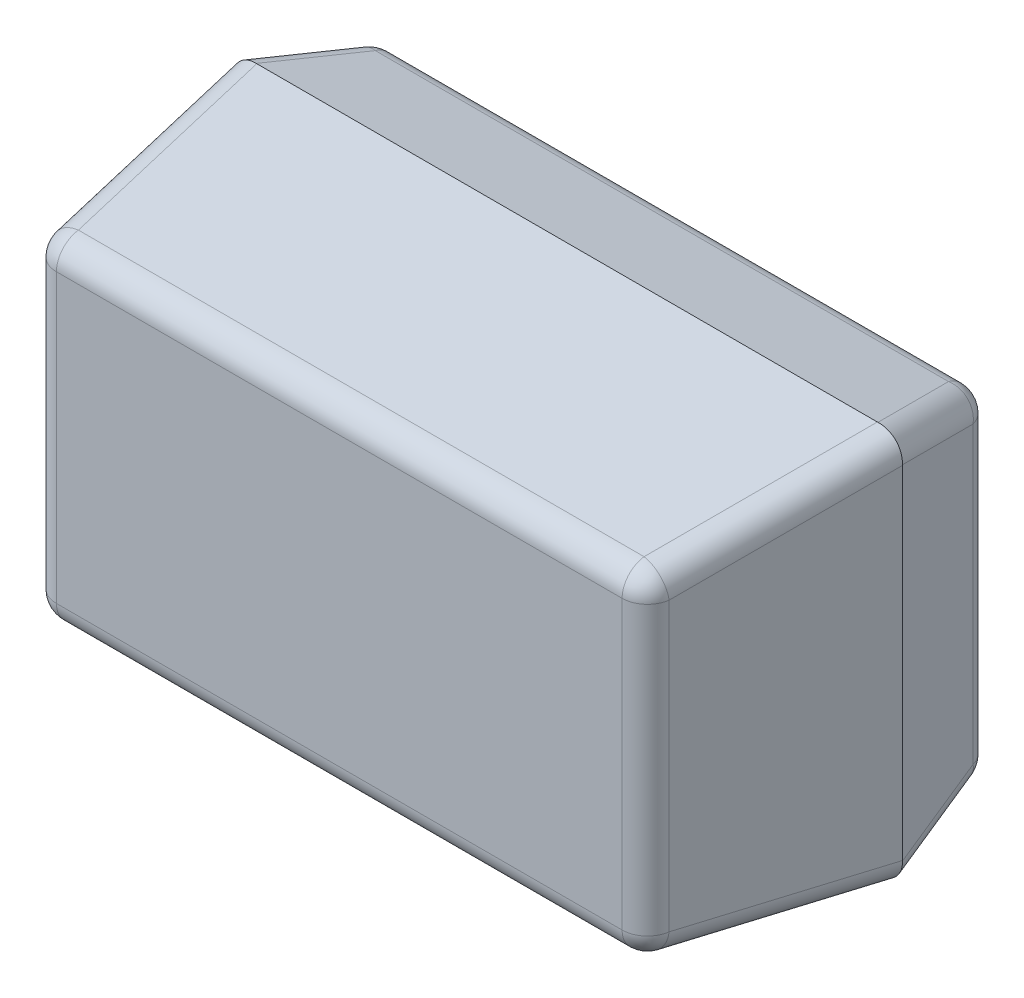
ISO-10303-21;
HEADER;
FILE_DESCRIPTION(('STEP AP214'),'2;1');
FILE_NAME('part.step','',(''),(''),'','','');
FILE_SCHEMA(('AUTOMOTIVE_DESIGN { 1 0 10303 214 1 1 1 1 }'));
ENDSEC;
DATA;
#1=APPLICATION_CONTEXT('core data for automotive mechanical design processes');
#2=APPLICATION_PROTOCOL_DEFINITION('international standard','automotive_design',2000,#1);
#3=PRODUCT_CONTEXT('',#1,'mechanical');
#4=PRODUCT('Part','Part','',(#3));
#5=PRODUCT_RELATED_PRODUCT_CATEGORY('part','',(#4));
#6=PRODUCT_DEFINITION_FORMATION('','',#4);
#7=PRODUCT_DEFINITION_CONTEXT('part definition',#1,'design');
#8=PRODUCT_DEFINITION('design','',#6,#7);
#9=PRODUCT_DEFINITION_SHAPE('','',#8);
#10=(LENGTH_UNIT() NAMED_UNIT(*) SI_UNIT(.MILLI.,.METRE.));
#11=(NAMED_UNIT(*) PLANE_ANGLE_UNIT() SI_UNIT($,.RADIAN.));
#12=(NAMED_UNIT(*) SI_UNIT($,.STERADIAN.) SOLID_ANGLE_UNIT());
#13=UNCERTAINTY_MEASURE_WITH_UNIT(LENGTH_MEASURE(1.E-05),#10,'distance_accuracy_value','');
#14=(GEOMETRIC_REPRESENTATION_CONTEXT(3) GLOBAL_UNCERTAINTY_ASSIGNED_CONTEXT((#13)) GLOBAL_UNIT_ASSIGNED_CONTEXT((#10,
#11,#12)) REPRESENTATION_CONTEXT('',''));
#15=CARTESIAN_POINT('',(0.,0.,0.));
#16=DIRECTION('',(0.,0.,1.));
#17=DIRECTION('',(1.,0.,0.));
#18=AXIS2_PLACEMENT_3D('',#15,#16,#17);
#19=CARTESIAN_POINT('',(-0.6625,-0.715,0.9));
#20=DIRECTION('',(0.,-0.991227900682643,0.132163720090952));
#21=DIRECTION('',(-1.,0.,0.));
#22=AXIS2_PLACEMENT_3D('',#19,#20,#21);
#23=PLANE('',#22);
#24=DIRECTION('',(0.131024356415955,0.131024356415955,0.982682673120662));
#25=VECTOR('',#24,1.);
#26=CARTESIAN_POINT('',(-1.152943695598,-0.702066485666,0.997001357502));
#27=LINE('',#26,#25);
#28=CARTESIAN_POINT('',(-1.225877209932,-0.775,0.45));
#29=VERTEX_POINT('',#28);
#30=CARTESIAN_POINT('',(-1.117448360331,-0.666571150399,1.263216372009));
#31=VERTEX_POINT('',#30);
#32=EDGE_CURVE('E402',#29,#31,#27,.T.);
#33=ORIENTED_EDGE('',*,*,#32,.F.);
#34=DIRECTION('',(1.,0.,0.));
#35=VECTOR('',#34,1.);
#36=CARTESIAN_POINT('',(-0.6625,-0.775,0.45));
#37=LINE('',#36,#35);
#38=CARTESIAN_POINT('',(1.225877209932,-0.775,0.45));
#39=VERTEX_POINT('',#38);
#40=EDGE_CURVE('E260',#29,#39,#37,.T.);
#41=ORIENTED_EDGE('',*,*,#40,.T.);
#42=DIRECTION('',(0.131024356415955,-0.131024356415955,-0.982682673120662));
#43=VECTOR('',#42,1.);
#44=CARTESIAN_POINT('',(1.148222665555,-0.697345455623,1.032409082824));
#45=LINE('',#44,#43);
#46=CARTESIAN_POINT('',(1.117448360331,-0.666571150399,1.263216372009));
#47=VERTEX_POINT('',#46);
#48=EDGE_CURVE('E365',#47,#39,#45,.T.);
#49=ORIENTED_EDGE('',*,*,#48,.F.);
#50=DIRECTION('',(1.,0.,0.));
#51=VECTOR('',#50,1.);
#52=CARTESIAN_POINT('',(-0.33125,-0.666571150399,1.263216372009));
#53=LINE('',#52,#51);
#54=EDGE_CURVE('E419',#31,#47,#53,.T.);
#55=ORIENTED_EDGE('',*,*,#54,.F.);
#56=EDGE_LOOP('',(#33,#41,#49,#55));
#57=FACE_BOUND('',#56,.T.);
#58=ADVANCED_FACE('F17',(#57),#23,.T.);
#59=CARTESIAN_POINT('',(0.6625,0.715,0.9));
#60=DIRECTION('',(0.,0.991227900682643,0.132163720090952));
#61=DIRECTION('',(1.,0.,0.));
#62=AXIS2_PLACEMENT_3D('',#59,#60,#61);
#63=PLANE('',#62);
#64=DIRECTION('',(-0.131024356415955,-0.131024356415955,0.982682673120662));
#65=VECTOR('',#64,1.);
#66=CARTESIAN_POINT('',(1.152943695598,0.702066485666,0.997001357502));
#67=LINE('',#66,#65);
#68=CARTESIAN_POINT('',(1.225877209932,0.775,0.45));
#69=VERTEX_POINT('',#68);
#70=CARTESIAN_POINT('',(1.117448360331,0.666571150399,1.263216372009));
#71=VERTEX_POINT('',#70);
#72=EDGE_CURVE('E308',#69,#71,#67,.T.);
#73=ORIENTED_EDGE('',*,*,#72,.F.);
#74=DIRECTION('',(-1.,0.,0.));
#75=VECTOR('',#74,1.);
#76=CARTESIAN_POINT('',(0.6625,0.775,0.45));
#77=LINE('',#76,#75);
#78=CARTESIAN_POINT('',(-1.225877209932,0.775,0.45));
#79=VERTEX_POINT('',#78);
#80=EDGE_CURVE('E11',#69,#79,#77,.T.);
#81=ORIENTED_EDGE('',*,*,#80,.T.);
#82=DIRECTION('',(-0.131024356415955,0.131024356415955,-0.982682673120662));
#83=VECTOR('',#82,1.);
#84=CARTESIAN_POINT('',(-1.148222665555,0.697345455623,1.032409082824));
#85=LINE('',#84,#83);
#86=CARTESIAN_POINT('',(-1.117448360331,0.666571150399,1.263216372009));
#87=VERTEX_POINT('',#86);
#88=EDGE_CURVE('E435',#87,#79,#85,.T.);
#89=ORIENTED_EDGE('',*,*,#88,.F.);
#90=DIRECTION('',(-1.,0.,0.));
#91=VECTOR('',#90,1.);
#92=CARTESIAN_POINT('',(0.33125,0.666571150399,1.263216372009));
#93=LINE('',#92,#91);
#94=EDGE_CURVE('E359',#71,#87,#93,.T.);
#95=ORIENTED_EDGE('',*,*,#94,.F.);
#96=EDGE_LOOP('',(#73,#81,#89,#95));
#97=FACE_BOUND('',#96,.T.);
#98=ADVANCED_FACE('F763',(#97),#63,.T.);
#99=CARTESIAN_POINT('',(1.265,-0.3875,0.9));
#100=DIRECTION('',(0.991227900682643,0.,0.132163720090952));
#101=DIRECTION('',(0.,-1.,0.));
#102=AXIS2_PLACEMENT_3D('',#99,#100,#101);
#103=PLANE('',#102);
#104=DIRECTION('',(-0.131024356415955,0.131024356415955,0.982682673120662));
#105=VECTOR('',#104,1.);
#106=CARTESIAN_POINT('',(1.247345455623,-0.598222665555,1.032409082824));
#107=LINE('',#106,#105);
#108=CARTESIAN_POINT('',(1.325,-0.675877209932,0.45));
#109=VERTEX_POINT('',#108);
#110=CARTESIAN_POINT('',(1.216571150399,-0.567448360331,1.263216372009));
#111=VERTEX_POINT('',#110);
#112=EDGE_CURVE('E369',#109,#111,#107,.T.);
#113=ORIENTED_EDGE('',*,*,#112,.F.);
#114=DIRECTION('',(0.,1.,0.));
#115=VECTOR('',#114,1.);
#116=CARTESIAN_POINT('',(1.325,-0.3875,0.45));
#117=LINE('',#116,#115);
#118=CARTESIAN_POINT('',(1.325,0.675877209932,0.45));
#119=VERTEX_POINT('',#118);
#120=EDGE_CURVE('E263',#109,#119,#117,.T.);
#121=ORIENTED_EDGE('',*,*,#120,.T.);
#122=DIRECTION('',(0.131024356415955,0.131024356415955,-0.982682673120662));
#123=VECTOR('',#122,1.);
#124=CARTESIAN_POINT('',(1.252066485666,0.602943695598,0.997001357502));
#125=LINE('',#124,#123);
#126=CARTESIAN_POINT('',(1.216571150399,0.567448360331,1.263216372009));
#127=VERTEX_POINT('',#126);
#128=EDGE_CURVE('E303',#127,#119,#125,.T.);
#129=ORIENTED_EDGE('',*,*,#128,.F.);
#130=DIRECTION('',(0.,1.,0.));
#131=VECTOR('',#130,1.);
#132=CARTESIAN_POINT('',(1.216571150399,-0.19375,1.263216372009));
#133=LINE('',#132,#131);
#134=EDGE_CURVE('E267',#111,#127,#133,.T.);
#135=ORIENTED_EDGE('',*,*,#134,.F.);
#136=EDGE_LOOP('',(#113,#121,#129,#135));
#137=FACE_BOUND('',#136,.T.);
#138=ADVANCED_FACE('F792',(#137),#103,.T.);
#139=CARTESIAN_POINT('',(-1.2675,0.3875,0.225));
#140=DIRECTION('',(-0.968862785912189,0.,-0.247598267511048));
#141=DIRECTION('',(-0.247598267511048,0.,0.968862785912189));
#142=AXIS2_PLACEMENT_3D('',#139,#140,#141);
#143=PLANE('',#142);
#144=CARTESIAN_POINT('',(-1.258704160598,-0.708704160598,0.190581497993));
#145=DIRECTION('',(0.968862785912141,0.,0.247598267511236));
#146=DIRECTION('',(-0.24512294411408,0.141048671963046,0.959176737836311));
#147=AXIS2_PLACEMENT_3D('',#144,#145,#146);
#148=ELLIPSE('',#147,0.270084021528,0.1);
#149=CARTESIAN_POINT('',(-1.325,-0.675877209932,0.45));
#150=VERTEX_POINT('',#149);
#151=CARTESIAN_POINT('',(-1.324984047907,-0.678097769315,0.449937578765));
#152=VERTEX_POINT('',#151);
#153=EDGE_CURVE('E396',#150,#152,#148,.T.);
#154=ORIENTED_EDGE('',*,*,#153,.F.);
#155=DIRECTION('',(0.,-1.,0.));
#156=VECTOR('',#155,1.);
#157=CARTESIAN_POINT('',(-1.325,0.3875,0.45));
#158=LINE('',#157,#156);
#159=CARTESIAN_POINT('',(-1.325,0.675877209932,0.45));
#160=VERTEX_POINT('',#159);
#161=EDGE_CURVE('E26',#160,#150,#158,.T.);
#162=ORIENTED_EDGE('',*,*,#161,.F.);
#163=CARTESIAN_POINT('',(-1.258704160598,0.708704160598,0.190581497993));
#164=DIRECTION('',(0.968862785912141,0.,0.247598267511236));
#165=DIRECTION('',(-0.24512294411408,-0.141048671963046,0.959176737836311));
#166=AXIS2_PLACEMENT_3D('',#163,#164,#165);
#167=ELLIPSE('',#166,0.270084021528,0.1);
#168=CARTESIAN_POINT('',(-1.324984047907,0.678097769315,0.449937578765));
#169=VERTEX_POINT('',#168);
#170=EDGE_CURVE('E272',#169,#160,#167,.T.);
#171=ORIENTED_EDGE('',*,*,#170,.F.);
#172=DIRECTION('',(-0.240340807740939,0.240340807740939,0.940464030289764));
#173=VECTOR('',#172,1.);
#174=CARTESIAN_POINT('',(-1.207823524937,0.560937246346,-0.008516641550139));
#175=LINE('',#174,#173);
#176=CARTESIAN_POINT('',(-1.229228044275,0.582341765683,0.07524017324891));
#177=VERTEX_POINT('',#176);
#178=EDGE_CURVE('E39',#177,#169,#175,.T.);
#179=ORIENTED_EDGE('',*,*,#178,.F.);
#180=DIRECTION('',(0.,1.,0.));
#181=VECTOR('',#180,1.);
#182=CARTESIAN_POINT('',(-1.229228044275,0.19375,0.07524017324891));
#183=LINE('',#182,#181);
#184=CARTESIAN_POINT('',(-1.229228044275,-0.582341765683,0.07524017324891));
#185=VERTEX_POINT('',#184);
#186=EDGE_CURVE('E201',#185,#177,#183,.T.);
#187=ORIENTED_EDGE('',*,*,#186,.F.);
#188=DIRECTION('',(0.240340807740939,0.240340807740939,-0.940464030289764));
#189=VECTOR('',#188,1.);
#190=CARTESIAN_POINT('',(-1.2237085435,-0.576822264909,0.05364212673988));
#191=LINE('',#190,#189);
#192=EDGE_CURVE('E205',#152,#185,#191,.T.);
#193=ORIENTED_EDGE('',*,*,#192,.F.);
#194=EDGE_LOOP('',(#154,#162,#171,#179,#187,#193));
#195=FACE_BOUND('',#194,.T.);
#196=ADVANCED_FACE('F204',(#195),#143,.T.);
#197=CARTESIAN_POINT('',(0.,0.,1.35));
#198=DIRECTION('',(0.,0.,1.));
#199=DIRECTION('',(1.,0.,0.));
#200=AXIS2_PLACEMENT_3D('',#197,#198,#199);
#201=PLANE('',#200);
#202=DIRECTION('',(1.,0.,0.));
#203=VECTOR('',#202,1.);
#204=CARTESIAN_POINT('',(0.33125,0.567448360331,1.35));
#205=LINE('',#204,#203);
#206=CARTESIAN_POINT('',(-1.117448360331,0.567448360331,1.35));
#207=VERTEX_POINT('',#206);
#208=CARTESIAN_POINT('',(1.117448360331,0.567448360331,1.35));
#209=VERTEX_POINT('',#208);
#210=EDGE_CURVE('E378',#207,#209,#205,.T.);
#211=ORIENTED_EDGE('',*,*,#210,.F.);
#212=DIRECTION('',(0.,1.,0.));
#213=VECTOR('',#212,1.);
#214=CARTESIAN_POINT('',(-1.117448360331,0.19375,1.35));
#215=LINE('',#214,#213);
#216=CARTESIAN_POINT('',(-1.117448360331,-0.567448360331,1.35));
#217=VERTEX_POINT('',#216);
#218=EDGE_CURVE('E374',#217,#207,#215,.T.);
#219=ORIENTED_EDGE('',*,*,#218,.F.);
#220=DIRECTION('',(-1.,0.,0.));
#221=VECTOR('',#220,1.);
#222=CARTESIAN_POINT('',(-0.33125,-0.567448360331,1.35));
#223=LINE('',#222,#221);
#224=CARTESIAN_POINT('',(1.117448360331,-0.567448360331,1.35));
#225=VERTEX_POINT('',#224);
#226=EDGE_CURVE('E423',#225,#217,#223,.T.);
#227=ORIENTED_EDGE('',*,*,#226,.F.);
#228=DIRECTION('',(0.,-1.,0.));
#229=VECTOR('',#228,1.);
#230=CARTESIAN_POINT('',(1.117448360331,-0.19375,1.35));
#231=LINE('',#230,#229);
#232=EDGE_CURVE('E264',#209,#225,#231,.T.);
#233=ORIENTED_EDGE('',*,*,#232,.F.);
#234=EDGE_LOOP('',(#211,#219,#227,#233));
#235=FACE_BOUND('',#234,.T.);
#236=ADVANCED_FACE('F757',(#235),#201,.T.);
#237=CARTESIAN_POINT('',(0.,0.,0.));
#238=DIRECTION('',(0.,0.,1.));
#239=DIRECTION('',(1.,0.,0.));
#240=AXIS2_PLACEMENT_3D('',#237,#238,#239);
#241=PLANE('',#240);
#242=DIRECTION('',(-1.,0.,0.));
#243=VECTOR('',#242,1.);
#244=CARTESIAN_POINT('',(0.33125,0.582341765683,0.));
#245=LINE('',#244,#243);
#246=CARTESIAN_POINT('',(1.132341765683,0.582341765683,0.));
#247=VERTEX_POINT('',#246);
#248=CARTESIAN_POINT('',(-1.132341765683,0.582341765683,0.));
#249=VERTEX_POINT('',#248);
#250=EDGE_CURVE('E238',#247,#249,#245,.T.);
#251=ORIENTED_EDGE('',*,*,#250,.F.);
#252=DIRECTION('',(0.,1.,0.));
#253=VECTOR('',#252,1.);
#254=CARTESIAN_POINT('',(1.132341765683,-0.19375,0.));
#255=LINE('',#254,#253);
#256=CARTESIAN_POINT('',(1.132341765683,-0.582341765683,0.));
#257=VERTEX_POINT('',#256);
#258=EDGE_CURVE('E224',#257,#247,#255,.T.);
#259=ORIENTED_EDGE('',*,*,#258,.F.);
#260=DIRECTION('',(1.,0.,0.));
#261=VECTOR('',#260,1.);
#262=CARTESIAN_POINT('',(-0.33125,-0.582341765683,0.));
#263=LINE('',#262,#261);
#264=CARTESIAN_POINT('',(-1.132341765683,-0.582341765683,0.));
#265=VERTEX_POINT('',#264);
#266=EDGE_CURVE('E361',#265,#257,#263,.T.);
#267=ORIENTED_EDGE('',*,*,#266,.F.);
#268=DIRECTION('',(0.,-1.,0.));
#269=VECTOR('',#268,1.);
#270=CARTESIAN_POINT('',(-1.132341765683,0.19375,0.));
#271=LINE('',#270,#269);
#272=EDGE_CURVE('E210',#249,#265,#271,.T.);
#273=ORIENTED_EDGE('',*,*,#272,.F.);
#274=EDGE_LOOP('',(#251,#259,#267,#273));
#275=FACE_BOUND('',#274,.T.);
#276=ADVANCED_FACE('F731',(#275),#241,.F.);
#277=CARTESIAN_POINT('',(0.6625,0.7175,0.225));
#278=DIRECTION('',(0.,0.968862785912189,-0.247598267511048));
#279=DIRECTION('',(-1.,0.,0.));
#280=AXIS2_PLACEMENT_3D('',#277,#278,#279);
#281=PLANE('',#280);
#282=CARTESIAN_POINT('',(1.258704160598,0.708704160598,0.190581497993));
#283=DIRECTION('',(0.,-0.968862785912141,0.247598267511236));
#284=DIRECTION('',(-0.141048671963046,0.24512294411408,0.959176737836311));
#285=AXIS2_PLACEMENT_3D('',#282,#283,#284);
#286=ELLIPSE('',#285,0.270084021528,0.1);
#287=CARTESIAN_POINT('',(1.228097769315,0.774984047907,0.449937578765));
#288=VERTEX_POINT('',#287);
#289=EDGE_CURVE('E356',#288,#69,#286,.T.);
#290=ORIENTED_EDGE('',*,*,#289,.F.);
#291=DIRECTION('',(0.240340807740939,0.240340807740939,0.940464030289764));
#292=VECTOR('',#291,1.);
#293=CARTESIAN_POINT('',(1.126822264909,0.6737085435,0.05364212673988));
#294=LINE('',#293,#292);
#295=CARTESIAN_POINT('',(1.132341765683,0.679228044275,0.07524017324891));
#296=VERTEX_POINT('',#295);
#297=EDGE_CURVE('E448',#296,#288,#294,.T.);
#298=ORIENTED_EDGE('',*,*,#297,.F.);
#299=DIRECTION('',(1.,0.,0.));
#300=VECTOR('',#299,1.);
#301=CARTESIAN_POINT('',(0.33125,0.679228044275,0.07524017324891));
#302=LINE('',#301,#300);
#303=CARTESIAN_POINT('',(-1.132341765683,0.679228044275,0.07524017324891));
#304=VERTEX_POINT('',#303);
#305=EDGE_CURVE('E247',#304,#296,#302,.T.);
#306=ORIENTED_EDGE('',*,*,#305,.F.);
#307=DIRECTION('',(0.240340807740939,-0.240340807740939,-0.940464030289764));
#308=VECTOR('',#307,1.);
#309=CARTESIAN_POINT('',(-1.110937246346,0.657823524937,-0.008516641550139));
#310=LINE('',#309,#308);
#311=CARTESIAN_POINT('',(-1.228097769315,0.774984047907,0.449937578765));
#312=VERTEX_POINT('',#311);
#313=EDGE_CURVE('E20',#312,#304,#310,.T.);
#314=ORIENTED_EDGE('',*,*,#313,.F.);
#315=CARTESIAN_POINT('',(-1.258704160598,0.708704160598,0.190581497993));
#316=DIRECTION('',(0.,-0.968862785912141,0.247598267511236));
#317=DIRECTION('',(0.141048671963046,0.24512294411408,0.959176737836311));
#318=AXIS2_PLACEMENT_3D('',#315,#316,#317);
#319=ELLIPSE('',#318,0.270084021528,0.1);
#320=EDGE_CURVE('E273',#79,#312,#319,.T.);
#321=ORIENTED_EDGE('',*,*,#320,.F.);
#322=ORIENTED_EDGE('',*,*,#80,.F.);
#323=EDGE_LOOP('',(#290,#298,#306,#314,#321,#322));
#324=FACE_BOUND('',#323,.T.);
#325=ADVANCED_FACE('F485',(#324),#281,.T.);
#326=CARTESIAN_POINT('',(-1.265,0.3875,0.9));
#327=DIRECTION('',(-0.991227900682643,0.,0.132163720090952));
#328=DIRECTION('',(0.,1.,0.));
#329=AXIS2_PLACEMENT_3D('',#326,#327,#328);
#330=PLANE('',#329);
#331=DIRECTION('',(-0.131024356415955,-0.131024356415955,-0.982682673120662));
#332=VECTOR('',#331,1.);
#333=CARTESIAN_POINT('',(-1.252066485666,-0.602943695598,0.997001357502));
#334=LINE('',#333,#332);
#335=CARTESIAN_POINT('',(-1.216571150399,-0.567448360331,1.263216372009));
#336=VERTEX_POINT('',#335);
#337=EDGE_CURVE('E399',#336,#150,#334,.T.);
#338=ORIENTED_EDGE('',*,*,#337,.F.);
#339=DIRECTION('',(0.,-1.,0.));
#340=VECTOR('',#339,1.);
#341=CARTESIAN_POINT('',(-1.216571150399,0.19375,1.263216372009));
#342=LINE('',#341,#340);
#343=CARTESIAN_POINT('',(-1.216571150399,0.567448360331,1.263216372009));
#344=VERTEX_POINT('',#343);
#345=EDGE_CURVE('E370',#344,#336,#342,.T.);
#346=ORIENTED_EDGE('',*,*,#345,.F.);
#347=DIRECTION('',(0.131024356415955,-0.131024356415955,0.982682673120662));
#348=VECTOR('',#347,1.);
#349=CARTESIAN_POINT('',(-1.247345455623,0.598222665555,1.032409082824));
#350=LINE('',#349,#348);
#351=EDGE_CURVE('E266',#160,#344,#350,.T.);
#352=ORIENTED_EDGE('',*,*,#351,.F.);
#353=ORIENTED_EDGE('',*,*,#161,.T.);
#354=EDGE_LOOP('',(#338,#346,#352,#353));
#355=FACE_BOUND('',#354,.T.);
#356=ADVANCED_FACE('F457',(#355),#330,.T.);
#357=CARTESIAN_POINT('',(1.2675,-0.3875,0.225));
#358=DIRECTION('',(0.968862785912189,0.,-0.247598267511048));
#359=DIRECTION('',(0.,-1.,0.));
#360=AXIS2_PLACEMENT_3D('',#357,#358,#359);
#361=PLANE('',#360);
#362=CARTESIAN_POINT('',(1.258704160598,-0.708704160598,0.190581497993));
#363=DIRECTION('',(-0.968862785912141,0.,0.247598267511236));
#364=DIRECTION('',(0.24512294411408,0.141048671963046,0.959176737836311));
#365=AXIS2_PLACEMENT_3D('',#362,#363,#364);
#366=ELLIPSE('',#365,0.270084021528,0.1);
#367=CARTESIAN_POINT('',(1.324984047907,-0.678097769315,0.449937578765));
#368=VERTEX_POINT('',#367);
#369=EDGE_CURVE('E348',#368,#109,#366,.T.);
#370=ORIENTED_EDGE('',*,*,#369,.F.);
#371=DIRECTION('',(0.240340807740939,-0.240340807740939,0.940464030289764));
#372=VECTOR('',#371,1.);
#373=CARTESIAN_POINT('',(1.207823524937,-0.560937246346,-0.008516641550139));
#374=LINE('',#373,#372);
#375=CARTESIAN_POINT('',(1.229228044275,-0.582341765683,0.07524017324891));
#376=VERTEX_POINT('',#375);
#377=EDGE_CURVE('E324',#376,#368,#374,.T.);
#378=ORIENTED_EDGE('',*,*,#377,.F.);
#379=DIRECTION('',(0.,-1.,0.));
#380=VECTOR('',#379,1.);
#381=CARTESIAN_POINT('',(1.229228044275,-0.19375,0.07524017324891));
#382=LINE('',#381,#380);
#383=CARTESIAN_POINT('',(1.229228044275,0.582341765683,0.07524017324891));
#384=VERTEX_POINT('',#383);
#385=EDGE_CURVE('E285',#384,#376,#382,.T.);
#386=ORIENTED_EDGE('',*,*,#385,.F.);
#387=DIRECTION('',(-0.240340807740939,-0.240340807740939,-0.940464030289764));
#388=VECTOR('',#387,1.);
#389=CARTESIAN_POINT('',(1.2237085435,0.576822264909,0.05364212673988));
#390=LINE('',#389,#388);
#391=CARTESIAN_POINT('',(1.324984047907,0.678097769315,0.449937578765));
#392=VERTEX_POINT('',#391);
#393=EDGE_CURVE('E445',#392,#384,#390,.T.);
#394=ORIENTED_EDGE('',*,*,#393,.F.);
#395=CARTESIAN_POINT('',(1.258704160598,0.708704160598,0.190581497993));
#396=DIRECTION('',(-0.968862785912141,0.,0.247598267511236));
#397=DIRECTION('',(0.24512294411408,-0.141048671963046,0.959176737836311));
#398=AXIS2_PLACEMENT_3D('',#395,#396,#397);
#399=ELLIPSE('',#398,0.270084021528,0.1);
#400=EDGE_CURVE('E307',#119,#392,#399,.T.);
#401=ORIENTED_EDGE('',*,*,#400,.F.);
#402=ORIENTED_EDGE('',*,*,#120,.F.);
#403=EDGE_LOOP('',(#370,#378,#386,#394,#401,#402));
#404=FACE_BOUND('',#403,.T.);
#405=ADVANCED_FACE('F772',(#404),#361,.T.);
#406=CARTESIAN_POINT('',(-0.6625,-0.7175,0.225));
#407=DIRECTION('',(0.,-0.968862785912189,-0.247598267511048));
#408=DIRECTION('',(0.,0.247598267511048,-0.968862785912189));
#409=AXIS2_PLACEMENT_3D('',#406,#407,#408);
#410=PLANE('',#409);
#411=CARTESIAN_POINT('',(-1.258704160598,-0.708704160598,0.190581497993));
#412=DIRECTION('',(0.,0.968862785912141,0.247598267511236));
#413=DIRECTION('',(0.141048671963046,-0.24512294411408,0.959176737836311));
#414=AXIS2_PLACEMENT_3D('',#411,#412,#413);
#415=ELLIPSE('',#414,0.270084021528,0.1);
#416=CARTESIAN_POINT('',(-1.228097769315,-0.774984047907,0.449937578765));
#417=VERTEX_POINT('',#416);
#418=EDGE_CURVE('E280',#417,#29,#415,.T.);
#419=ORIENTED_EDGE('',*,*,#418,.F.);
#420=DIRECTION('',(-0.240340807740939,-0.240340807740939,0.940464030289764));
#421=VECTOR('',#420,1.);
#422=CARTESIAN_POINT('',(-1.126822264909,-0.6737085435,0.05364212673988));
#423=LINE('',#422,#421);
#424=CARTESIAN_POINT('',(-1.132341765683,-0.679228044275,0.07524017324891));
#425=VERTEX_POINT('',#424);
#426=EDGE_CURVE('E223',#425,#417,#423,.T.);
#427=ORIENTED_EDGE('',*,*,#426,.F.);
#428=DIRECTION('',(-1.,0.,0.));
#429=VECTOR('',#428,1.);
#430=CARTESIAN_POINT('',(-0.33125,-0.679228044275,0.07524017324891));
#431=LINE('',#430,#429);
#432=CARTESIAN_POINT('',(1.132341765683,-0.679228044275,0.07524017324891));
#433=VERTEX_POINT('',#432);
#434=EDGE_CURVE('E364',#433,#425,#431,.T.);
#435=ORIENTED_EDGE('',*,*,#434,.F.);
#436=DIRECTION('',(-0.240340807740939,0.240340807740939,-0.940464030289764));
#437=VECTOR('',#436,1.);
#438=CARTESIAN_POINT('',(1.110937246346,-0.657823524937,-0.008516641550139));
#439=LINE('',#438,#437);
#440=CARTESIAN_POINT('',(1.228097769315,-0.774984047907,0.449937578765));
#441=VERTEX_POINT('',#440);
#442=EDGE_CURVE('E320',#441,#433,#439,.T.);
#443=ORIENTED_EDGE('',*,*,#442,.F.);
#444=CARTESIAN_POINT('',(1.258704160598,-0.708704160598,0.190581497993));
#445=DIRECTION('',(0.,0.968862785912141,0.247598267511236));
#446=DIRECTION('',(-0.141048671963046,-0.24512294411408,0.959176737836311));
#447=AXIS2_PLACEMENT_3D('',#444,#445,#446);
#448=ELLIPSE('',#447,0.270084021528,0.1);
#449=EDGE_CURVE('E352',#39,#441,#448,.T.);
#450=ORIENTED_EDGE('',*,*,#449,.F.);
#451=ORIENTED_EDGE('',*,*,#40,.F.);
#452=EDGE_LOOP('',(#419,#427,#435,#443,#450,#451));
#453=FACE_BOUND('',#452,.T.);
#454=ADVANCED_FACE('F738',(#453),#410,.T.);
#455=CARTESIAN_POINT('',(-1.132341765683,0.19375,0.1));
#456=DIRECTION('',(0.,-1.,0.));
#457=DIRECTION('',(-0.613352155164104,0.,-0.789809555371134));
#458=AXIS2_PLACEMENT_3D('',#455,#456,#457);
#459=CYLINDRICAL_SURFACE('',#458,0.1);
#460=CARTESIAN_POINT('',(-1.132341765683,-0.582341765683,0.1));
#461=DIRECTION('',(0.,-1.,0.));
#462=DIRECTION('',(0.,0.,-1.));
#463=AXIS2_PLACEMENT_3D('',#460,#461,#462);
#464=CIRCLE('',#463,0.1);
#465=EDGE_CURVE('E229',#185,#265,#464,.T.);
#466=ORIENTED_EDGE('',*,*,#465,.F.);
#467=ORIENTED_EDGE('',*,*,#186,.T.);
#468=CARTESIAN_POINT('',(-1.132341765683,0.582341765683,0.1));
#469=DIRECTION('',(0.,1.,0.));
#470=DIRECTION('',(-0.968862785912189,0.,-0.247598267511048));
#471=AXIS2_PLACEMENT_3D('',#468,#469,#470);
#472=CIRCLE('',#471,0.1);
#473=EDGE_CURVE('E498',#249,#177,#472,.T.);
#474=ORIENTED_EDGE('',*,*,#473,.F.);
#475=ORIENTED_EDGE('',*,*,#272,.T.);
#476=EDGE_LOOP('',(#466,#467,#474,#475));
#477=FACE_BOUND('',#476,.T.);
#478=ADVANCED_FACE('F235',(#477),#459,.T.);
#479=CARTESIAN_POINT('',(-1.110937246346,0.560937246346,0.01624318520095));
#480=DIRECTION('',(0.240340807740951,-0.240340807740951,-0.940464030289758));
#481=DIRECTION('',(-0.665008493279918,0.665008493279918,-0.339893229898959));
#482=AXIS2_PLACEMENT_3D('',#479,#480,#481);
#483=CYLINDRICAL_SURFACE('',#482,0.1);
#484=ORIENTED_EDGE('',*,*,#313,.T.);
#485=CARTESIAN_POINT('',(-1.132341765683,0.582341765683,0.1));
#486=DIRECTION('',(0.240340807740939,-0.240340807740873,-0.940464030289781));
#487=DIRECTION('',(0.,0.968862785912189,-0.247598267511048));
#488=AXIS2_PLACEMENT_3D('',#485,#486,#487);
#489=CIRCLE('',#488,0.1);
#490=EDGE_CURVE('E480',#177,#304,#489,.T.);
#491=ORIENTED_EDGE('',*,*,#490,.F.);
#492=ORIENTED_EDGE('',*,*,#178,.T.);
#493=CARTESIAN_POINT('',(-1.223316575499,0.673316575499,0.455988386235));
#494=DIRECTION('',(-0.0566597154763704,0.0566597154763704,0.996784506944341));
#495=DIRECTION('',(0.704833084242033,-0.704833084242033,0.0801289380668838));
#496=AXIS2_PLACEMENT_3D('',#493,#494,#495);
#497=ELLIPSE('',#496,0.103661827273,0.1);
#498=EDGE_CURVE('E269',#312,#169,#497,.T.);
#499=ORIENTED_EDGE('',*,*,#498,.F.);
#500=EDGE_LOOP('',(#484,#491,#492,#499));
#501=FACE_BOUND('',#500,.T.);
#502=ADVANCED_FACE('F478',(#501),#483,.T.);
#503=CARTESIAN_POINT('',(-0.33125,-0.582341765683,0.1));
#504=DIRECTION('',(1.,0.,0.));
#505=DIRECTION('',(0.,-0.613352155164104,-0.789809555371134));
#506=AXIS2_PLACEMENT_3D('',#503,#504,#505);
#507=CYLINDRICAL_SURFACE('',#506,0.1);
#508=CARTESIAN_POINT('',(1.132341765683,-0.582341765683,0.1));
#509=DIRECTION('',(1.,0.,0.));
#510=DIRECTION('',(0.,0.,-1.));
#511=AXIS2_PLACEMENT_3D('',#508,#509,#510);
#512=CIRCLE('',#511,0.1);
#513=EDGE_CURVE('E233',#433,#257,#512,.T.);
#514=ORIENTED_EDGE('',*,*,#513,.F.);
#515=ORIENTED_EDGE('',*,*,#434,.T.);
#516=CARTESIAN_POINT('',(-1.132341765683,-0.582341765683,0.1));
#517=DIRECTION('',(-1.,0.,0.));
#518=DIRECTION('',(0.,-0.968862785912189,-0.247598267511048));
#519=AXIS2_PLACEMENT_3D('',#516,#517,#518);
#520=CIRCLE('',#519,0.1);
#521=EDGE_CURVE('E231',#265,#425,#520,.T.);
#522=ORIENTED_EDGE('',*,*,#521,.F.);
#523=ORIENTED_EDGE('',*,*,#266,.T.);
#524=EDGE_LOOP('',(#514,#515,#522,#523));
#525=FACE_BOUND('',#524,.T.);
#526=ADVANCED_FACE('F734',(#525),#507,.T.);
#527=CARTESIAN_POINT('',(1.126822264909,0.576822264909,0.07840195349097));
#528=DIRECTION('',(0.240340807740951,0.240340807740951,0.940464030289758));
#529=DIRECTION('',(0.665008493279918,0.665008493279918,-0.339893229898959));
#530=AXIS2_PLACEMENT_3D('',#527,#528,#529);
#531=CYLINDRICAL_SURFACE('',#530,0.1);
#532=ORIENTED_EDGE('',*,*,#393,.T.);
#533=CARTESIAN_POINT('',(1.132341765683,0.582341765683,0.1));
#534=DIRECTION('',(-0.240340807740873,-0.240340807740939,-0.940464030289781));
#535=DIRECTION('',(0.968862785912189,0.,-0.247598267511048));
#536=AXIS2_PLACEMENT_3D('',#533,#534,#535);
#537=CIRCLE('',#536,0.1);
#538=EDGE_CURVE('E256',#296,#384,#537,.T.);
#539=ORIENTED_EDGE('',*,*,#538,.F.);
#540=ORIENTED_EDGE('',*,*,#297,.T.);
#541=CARTESIAN_POINT('',(1.223316575499,0.673316575499,0.455988386235));
#542=DIRECTION('',(0.0566597154763704,0.0566597154763704,0.996784506944341));
#543=DIRECTION('',(0.704833084242033,0.704833084242033,-0.0801289380668838));
#544=AXIS2_PLACEMENT_3D('',#541,#542,#543);
#545=ELLIPSE('',#544,0.103661827273,0.1);
#546=EDGE_CURVE('E347',#392,#288,#545,.T.);
#547=ORIENTED_EDGE('',*,*,#546,.F.);
#548=EDGE_LOOP('',(#532,#539,#540,#547));
#549=FACE_BOUND('',#548,.T.);
#550=ADVANCED_FACE('F770',(#549),#531,.T.);
#551=CARTESIAN_POINT('',(-1.148222665555,0.598222665555,1.019192710815));
#552=DIRECTION('',(-0.13102435641622,0.13102435641622,-0.982682673120591));
#553=DIRECTION('',(-0.694861581918094,0.694861581918094,0.185296421845025));
#554=AXIS2_PLACEMENT_3D('',#551,#552,#553);
#555=CYLINDRICAL_SURFACE('',#554,0.1);
#556=ORIENTED_EDGE('',*,*,#351,.T.);
#557=CARTESIAN_POINT('',(-1.117448360331,0.567448360331,1.25));
#558=DIRECTION('',(0.131024356416021,-0.131024356415955,0.982682673120653));
#559=DIRECTION('',(-0.991227900682643,0.,0.132163720090952));
#560=AXIS2_PLACEMENT_3D('',#557,#558,#559);
#561=CIRCLE('',#560,0.1);
#562=EDGE_CURVE('E316',#87,#344,#561,.T.);
#563=ORIENTED_EDGE('',*,*,#562,.F.);
#564=ORIENTED_EDGE('',*,*,#88,.T.);
#565=ORIENTED_EDGE('',*,*,#320,.T.);
#566=ORIENTED_EDGE('',*,*,#498,.T.);
#567=ORIENTED_EDGE('',*,*,#170,.T.);
#568=EDGE_LOOP('',(#556,#563,#564,#565,#566,#567));
#569=FACE_BOUND('',#568,.T.);
#570=ADVANCED_FACE('F477',(#569),#555,.T.);
#571=CARTESIAN_POINT('',(1.117448360331,-0.19375,1.25));
#572=DIRECTION('',(0.,-1.,0.));
#573=DIRECTION('',(0.65872463135595,0.,0.752384117352943));
#574=AXIS2_PLACEMENT_3D('',#571,#572,#573);
#575=CYLINDRICAL_SURFACE('',#574,0.1);
#576=CARTESIAN_POINT('',(1.117448360331,-0.567448360331,1.25));
#577=DIRECTION('',(0.,-1.,0.));
#578=DIRECTION('',(0.,0.,1.));
#579=AXIS2_PLACEMENT_3D('',#576,#577,#578);
#580=CIRCLE('',#579,0.1);
#581=EDGE_CURVE('E275',#111,#225,#580,.T.);
#582=ORIENTED_EDGE('',*,*,#581,.F.);
#583=ORIENTED_EDGE('',*,*,#134,.T.);
#584=CARTESIAN_POINT('',(1.117448360331,0.567448360331,1.25));
#585=DIRECTION('',(0.,1.,0.));
#586=DIRECTION('',(0.991227900682643,0.,0.132163720090952));
#587=AXIS2_PLACEMENT_3D('',#584,#585,#586);
#588=CIRCLE('',#587,0.1);
#589=EDGE_CURVE('E329',#209,#127,#588,.T.);
#590=ORIENTED_EDGE('',*,*,#589,.F.);
#591=ORIENTED_EDGE('',*,*,#232,.T.);
#592=EDGE_LOOP('',(#582,#583,#590,#591));
#593=FACE_BOUND('',#592,.T.);
#594=ADVANCED_FACE('F752',(#593),#575,.T.);
#595=CARTESIAN_POINT('',(1.148222665555,-0.598222665555,1.019192710815));
#596=DIRECTION('',(0.13102435641622,-0.13102435641622,-0.982682673120591));
#597=DIRECTION('',(0.694861581918094,-0.694861581918094,0.185296421845025));
#598=AXIS2_PLACEMENT_3D('',#595,#596,#597);
#599=CYLINDRICAL_SURFACE('',#598,0.1);
#600=ORIENTED_EDGE('',*,*,#112,.T.);
#601=CARTESIAN_POINT('',(1.117448360331,-0.567448360331,1.25));
#602=DIRECTION('',(-0.131024356416021,0.131024356415955,0.982682673120653));
#603=DIRECTION('',(0.991227900682643,0.,0.132163720090952));
#604=AXIS2_PLACEMENT_3D('',#601,#602,#603);
#605=CIRCLE('',#604,0.1);
#606=EDGE_CURVE('E415',#47,#111,#605,.T.);
#607=ORIENTED_EDGE('',*,*,#606,.F.);
#608=ORIENTED_EDGE('',*,*,#48,.T.);
#609=ORIENTED_EDGE('',*,*,#449,.T.);
#610=CARTESIAN_POINT('',(1.223316575499,-0.673316575499,0.455988386235));
#611=DIRECTION('',(-0.0566597154763704,0.0566597154763704,-0.996784506944341));
#612=DIRECTION('',(-0.704833084242033,0.704833084242033,0.0801289380668838));
#613=AXIS2_PLACEMENT_3D('',#610,#611,#612);
#614=ELLIPSE('',#613,0.103661827273,0.1);
#615=EDGE_CURVE('E325',#368,#441,#614,.T.);
#616=ORIENTED_EDGE('',*,*,#615,.F.);
#617=ORIENTED_EDGE('',*,*,#369,.T.);
#618=EDGE_LOOP('',(#600,#607,#608,#609,#616,#617));
#619=FACE_BOUND('',#618,.T.);
#620=ADVANCED_FACE('F746',(#619),#599,.T.);
#621=CARTESIAN_POINT('',(-0.33125,-0.567448360331,1.25));
#622=DIRECTION('',(-1.,0.,0.));
#623=DIRECTION('',(0.,-0.65872463135595,0.752384117352943));
#624=AXIS2_PLACEMENT_3D('',#621,#622,#623);
#625=CYLINDRICAL_SURFACE('',#624,0.1);
#626=CARTESIAN_POINT('',(-1.117448360331,-0.567448360331,1.25));
#627=DIRECTION('',(-1.,0.,0.));
#628=DIRECTION('',(0.,0.,1.));
#629=AXIS2_PLACEMENT_3D('',#626,#627,#628);
#630=CIRCLE('',#629,0.1);
#631=EDGE_CURVE('E383',#31,#217,#630,.T.);
#632=ORIENTED_EDGE('',*,*,#631,.F.);
#633=ORIENTED_EDGE('',*,*,#54,.T.);
#634=CARTESIAN_POINT('',(1.117448360331,-0.567448360331,1.25));
#635=DIRECTION('',(1.,0.,0.));
#636=DIRECTION('',(0.,-0.991227900682643,0.132163720090952));
#637=AXIS2_PLACEMENT_3D('',#634,#635,#636);
#638=CIRCLE('',#637,0.1);
#639=EDGE_CURVE('E279',#225,#47,#638,.T.);
#640=ORIENTED_EDGE('',*,*,#639,.F.);
#641=ORIENTED_EDGE('',*,*,#226,.T.);
#642=EDGE_LOOP('',(#632,#633,#640,#641));
#643=FACE_BOUND('',#642,.T.);
#644=ADVANCED_FACE('F744',(#643),#625,.T.);
#645=CARTESIAN_POINT('',(1.117448360331,-0.567448360331,1.25));
#646=DIRECTION('',(-0.323969735598941,-0.851049730521846,-0.413228709789925));
#647=DIRECTION('',(0.525085094226916,-0.525085094226916,0.669754647345893));
#648=AXIS2_PLACEMENT_3D('',#645,#646,#647);
#649=SPHERICAL_SURFACE('',#648,0.1);
#650=ORIENTED_EDGE('',*,*,#581,.T.);
#651=ORIENTED_EDGE('',*,*,#639,.T.);
#652=ORIENTED_EDGE('',*,*,#606,.T.);
#653=EDGE_LOOP('',(#650,#651,#652));
#654=FACE_BOUND('',#653,.T.);
#655=ADVANCED_FACE('F750',(#654),#649,.T.);
#656=CARTESIAN_POINT('',(-1.152943695598,-0.602943695598,0.983784985493));
#657=DIRECTION('',(-0.13102435641622,-0.13102435641622,-0.982682673120591));
#658=DIRECTION('',(-0.694861581918094,-0.694861581918094,0.185296421845025));
#659=AXIS2_PLACEMENT_3D('',#656,#657,#658);
#660=CYLINDRICAL_SURFACE('',#659,0.1);
#661=ORIENTED_EDGE('',*,*,#32,.T.);
#662=CARTESIAN_POINT('',(-1.117448360331,-0.567448360331,1.25));
#663=DIRECTION('',(0.131024356415955,0.131024356416021,0.982682673120653));
#664=DIRECTION('',(0.,-0.991227900682643,0.132163720090952));
#665=AXIS2_PLACEMENT_3D('',#662,#663,#664);
#666=CIRCLE('',#665,0.1);
#667=EDGE_CURVE('E375',#336,#31,#666,.T.);
#668=ORIENTED_EDGE('',*,*,#667,.F.);
#669=ORIENTED_EDGE('',*,*,#337,.T.);
#670=ORIENTED_EDGE('',*,*,#153,.T.);
#671=CARTESIAN_POINT('',(-1.223316575499,-0.673316575499,0.455988386235));
#672=DIRECTION('',(0.0566597154763774,0.0566597154763774,-0.996784506944341));
#673=DIRECTION('',(0.704833084242033,0.704833084242033,0.0801289380668937));
#674=AXIS2_PLACEMENT_3D('',#671,#672,#673);
#675=ELLIPSE('',#674,0.103661827273,0.1);
#676=EDGE_CURVE('E221',#417,#152,#675,.T.);
#677=ORIENTED_EDGE('',*,*,#676,.F.);
#678=ORIENTED_EDGE('',*,*,#418,.T.);
#679=EDGE_LOOP('',(#661,#668,#669,#670,#677,#678));
#680=FACE_BOUND('',#679,.T.);
#681=ADVANCED_FACE('F461',(#680),#660,.T.);
#682=CARTESIAN_POINT('',(-1.117448360331,0.19375,1.25));
#683=DIRECTION('',(0.,1.,0.));
#684=DIRECTION('',(-0.65872463135595,0.,0.752384117352943));
#685=AXIS2_PLACEMENT_3D('',#682,#683,#684);
#686=CYLINDRICAL_SURFACE('',#685,0.1);
#687=CARTESIAN_POINT('',(-1.117448360331,0.567448360331,1.25));
#688=DIRECTION('',(0.,1.,0.));
#689=DIRECTION('',(0.,0.,1.));
#690=AXIS2_PLACEMENT_3D('',#687,#688,#689);
#691=CIRCLE('',#690,0.1);
#692=EDGE_CURVE('E302',#344,#207,#691,.T.);
#693=ORIENTED_EDGE('',*,*,#692,.F.);
#694=ORIENTED_EDGE('',*,*,#345,.T.);
#695=CARTESIAN_POINT('',(-1.117448360331,-0.567448360331,1.25));
#696=DIRECTION('',(0.,-1.,0.));
#697=DIRECTION('',(-0.991227900682643,0.,0.132163720090952));
#698=AXIS2_PLACEMENT_3D('',#695,#696,#697);
#699=CIRCLE('',#698,0.1);
#700=EDGE_CURVE('E387',#217,#336,#699,.T.);
#701=ORIENTED_EDGE('',*,*,#700,.F.);
#702=ORIENTED_EDGE('',*,*,#218,.T.);
#703=EDGE_LOOP('',(#693,#694,#701,#702));
#704=FACE_BOUND('',#703,.T.);
#705=ADVANCED_FACE('F469',(#704),#686,.T.);
#706=CARTESIAN_POINT('',(-1.117448360331,-0.567448360331,1.25));
#707=DIRECTION('',(0.323969735598941,-0.851049730521846,-0.413228709789925));
#708=DIRECTION('',(-0.525085094226916,-0.525085094226916,0.669754647345893));
#709=AXIS2_PLACEMENT_3D('',#706,#707,#708);
#710=SPHERICAL_SURFACE('',#709,0.1);
#711=ORIENTED_EDGE('',*,*,#631,.T.);
#712=ORIENTED_EDGE('',*,*,#700,.T.);
#713=ORIENTED_EDGE('',*,*,#667,.T.);
#714=EDGE_LOOP('',(#711,#712,#713));
#715=FACE_BOUND('',#714,.T.);
#716=ADVANCED_FACE('F466',(#715),#710,.T.);
#717=CARTESIAN_POINT('',(0.33125,0.567448360331,1.25));
#718=DIRECTION('',(1.,0.,0.));
#719=DIRECTION('',(0.,0.65872463135595,0.752384117352943));
#720=AXIS2_PLACEMENT_3D('',#717,#718,#719);
#721=CYLINDRICAL_SURFACE('',#720,0.1);
#722=CARTESIAN_POINT('',(1.117448360331,0.567448360331,1.25));
#723=DIRECTION('',(1.,0.,0.));
#724=DIRECTION('',(0.,0.,1.));
#725=AXIS2_PLACEMENT_3D('',#722,#723,#724);
#726=CIRCLE('',#725,0.1);
#727=EDGE_CURVE('E337',#71,#209,#726,.T.);
#728=ORIENTED_EDGE('',*,*,#727,.F.);
#729=ORIENTED_EDGE('',*,*,#94,.T.);
#730=CARTESIAN_POINT('',(-1.117448360331,0.567448360331,1.25));
#731=DIRECTION('',(-1.,0.,0.));
#732=DIRECTION('',(0.,0.991227900682643,0.132163720090952));
#733=AXIS2_PLACEMENT_3D('',#730,#731,#732);
#734=CIRCLE('',#733,0.1);
#735=EDGE_CURVE('E312',#207,#87,#734,.T.);
#736=ORIENTED_EDGE('',*,*,#735,.F.);
#737=ORIENTED_EDGE('',*,*,#210,.T.);
#738=EDGE_LOOP('',(#728,#729,#736,#737));
#739=FACE_BOUND('',#738,.T.);
#740=ADVANCED_FACE('F760',(#739),#721,.T.);
#741=CARTESIAN_POINT('',(1.152943695598,0.602943695598,0.983784985493));
#742=DIRECTION('',(-0.13102435641622,-0.13102435641622,0.982682673120591));
#743=DIRECTION('',(0.694861581918094,0.694861581918094,0.185296421845025));
#744=AXIS2_PLACEMENT_3D('',#741,#742,#743);
#745=CYLINDRICAL_SURFACE('',#744,0.1);
#746=ORIENTED_EDGE('',*,*,#72,.T.);
#747=CARTESIAN_POINT('',(1.117448360331,0.567448360331,1.25));
#748=DIRECTION('',(-0.131024356415955,-0.131024356416021,0.982682673120653));
#749=DIRECTION('',(0.,0.991227900682643,0.132163720090952));
#750=AXIS2_PLACEMENT_3D('',#747,#748,#749);
#751=CIRCLE('',#750,0.1);
#752=EDGE_CURVE('E333',#127,#71,#751,.T.);
#753=ORIENTED_EDGE('',*,*,#752,.F.);
#754=ORIENTED_EDGE('',*,*,#128,.T.);
#755=ORIENTED_EDGE('',*,*,#400,.T.);
#756=ORIENTED_EDGE('',*,*,#546,.T.);
#757=ORIENTED_EDGE('',*,*,#289,.T.);
#758=EDGE_LOOP('',(#746,#753,#754,#755,#756,#757));
#759=FACE_BOUND('',#758,.T.);
#760=ADVANCED_FACE('F766',(#759),#745,.T.);
#761=CARTESIAN_POINT('',(1.117448360331,0.567448360331,1.25));
#762=DIRECTION('',(0.323969735598941,-0.851049730521846,0.413228709789925));
#763=DIRECTION('',(0.525085094226916,0.525085094226916,0.669754647345893));
#764=AXIS2_PLACEMENT_3D('',#761,#762,#763);
#765=SPHERICAL_SURFACE('',#764,0.1);
#766=ORIENTED_EDGE('',*,*,#589,.T.);
#767=ORIENTED_EDGE('',*,*,#752,.T.);
#768=ORIENTED_EDGE('',*,*,#727,.T.);
#769=EDGE_LOOP('',(#766,#767,#768));
#770=FACE_BOUND('',#769,.T.);
#771=ADVANCED_FACE('F947',(#770),#765,.T.);
#772=CARTESIAN_POINT('',(1.110937246346,-0.560937246346,0.01624318520095));
#773=DIRECTION('',(0.240340807740951,-0.240340807740951,0.940464030289758));
#774=DIRECTION('',(0.665008493279918,-0.665008493279918,-0.339893229898959));
#775=AXIS2_PLACEMENT_3D('',#772,#773,#774);
#776=CYLINDRICAL_SURFACE('',#775,0.1);
#777=ORIENTED_EDGE('',*,*,#442,.T.);
#778=CARTESIAN_POINT('',(1.132341765683,-0.582341765683,0.1));
#779=DIRECTION('',(-0.240340807740939,0.240340807740873,-0.940464030289781));
#780=DIRECTION('',(0.,-0.968862785912189,-0.247598267511048));
#781=AXIS2_PLACEMENT_3D('',#778,#779,#780);
#782=CIRCLE('',#781,0.1);
#783=EDGE_CURVE('E289',#376,#433,#782,.T.);
#784=ORIENTED_EDGE('',*,*,#783,.F.);
#785=ORIENTED_EDGE('',*,*,#377,.T.);
#786=ORIENTED_EDGE('',*,*,#615,.T.);
#787=EDGE_LOOP('',(#777,#784,#785,#786));
#788=FACE_BOUND('',#787,.T.);
#789=ADVANCED_FACE('F775',(#788),#776,.T.);
#790=CARTESIAN_POINT('',(-1.117448360331,0.567448360331,1.25));
#791=DIRECTION('',(-0.323969735598941,-0.851049730521846,0.413228709789925));
#792=DIRECTION('',(-0.525085094226916,0.525085094226916,0.669754647345893));
#793=AXIS2_PLACEMENT_3D('',#790,#791,#792);
#794=SPHERICAL_SURFACE('',#793,0.1);
#795=ORIENTED_EDGE('',*,*,#692,.T.);
#796=ORIENTED_EDGE('',*,*,#735,.T.);
#797=ORIENTED_EDGE('',*,*,#562,.T.);
#798=EDGE_LOOP('',(#795,#796,#797));
#799=FACE_BOUND('',#798,.T.);
#800=ADVANCED_FACE('F474',(#799),#794,.T.);
#801=CARTESIAN_POINT('',(-1.126822264909,-0.576822264909,0.07840195349097));
#802=DIRECTION('',(-0.240340807740951,-0.240340807740951,0.940464030289758));
#803=DIRECTION('',(-0.665008493279918,-0.665008493279918,-0.339893229898959));
#804=AXIS2_PLACEMENT_3D('',#801,#802,#803);
#805=CYLINDRICAL_SURFACE('',#804,0.1);
#806=ORIENTED_EDGE('',*,*,#192,.T.);
#807=CARTESIAN_POINT('',(-1.132341765683,-0.582341765683,0.1));
#808=DIRECTION('',(0.240340807740873,0.240340807740939,-0.940464030289781));
#809=DIRECTION('',(-0.968862785912189,0.,-0.247598267511048));
#810=AXIS2_PLACEMENT_3D('',#807,#808,#809);
#811=CIRCLE('',#810,0.1);
#812=EDGE_CURVE('E218',#425,#185,#811,.T.);
#813=ORIENTED_EDGE('',*,*,#812,.F.);
#814=ORIENTED_EDGE('',*,*,#426,.T.);
#815=ORIENTED_EDGE('',*,*,#676,.T.);
#816=EDGE_LOOP('',(#806,#813,#814,#815));
#817=FACE_BOUND('',#816,.T.);
#818=ADVANCED_FACE('F216',(#817),#805,.T.);
#819=CARTESIAN_POINT('',(1.132341765683,-0.19375,0.1));
#820=DIRECTION('',(0.,1.,0.));
#821=DIRECTION('',(0.613352155164104,0.,-0.789809555371134));
#822=AXIS2_PLACEMENT_3D('',#819,#820,#821);
#823=CYLINDRICAL_SURFACE('',#822,0.1);
#824=CARTESIAN_POINT('',(1.132341765683,0.582341765683,0.1));
#825=DIRECTION('',(0.,1.,0.));
#826=DIRECTION('',(0.,0.,-1.));
#827=AXIS2_PLACEMENT_3D('',#824,#825,#826);
#828=CIRCLE('',#827,0.1);
#829=EDGE_CURVE('E495',#384,#247,#828,.T.);
#830=ORIENTED_EDGE('',*,*,#829,.F.);
#831=ORIENTED_EDGE('',*,*,#385,.T.);
#832=CARTESIAN_POINT('',(1.132341765683,-0.582341765683,0.1));
#833=DIRECTION('',(0.,-1.,0.));
#834=DIRECTION('',(0.968862785912189,0.,-0.247598267511048));
#835=AXIS2_PLACEMENT_3D('',#832,#833,#834);
#836=CIRCLE('',#835,0.1);
#837=EDGE_CURVE('E284',#257,#376,#836,.T.);
#838=ORIENTED_EDGE('',*,*,#837,.F.);
#839=ORIENTED_EDGE('',*,*,#258,.T.);
#840=EDGE_LOOP('',(#830,#831,#838,#839));
#841=FACE_BOUND('',#840,.T.);
#842=ADVANCED_FACE('F725',(#841),#823,.T.);
#843=CARTESIAN_POINT('',(1.132341765683,-0.582341765683,0.1));
#844=DIRECTION('',(-0.259788861624052,-0.878506562422178,0.400918903467081));
#845=DIRECTION('',(0.477730279322093,-0.477730279322093,-0.737256780530143));
#846=AXIS2_PLACEMENT_3D('',#843,#844,#845);
#847=SPHERICAL_SURFACE('',#846,0.1);
#848=ORIENTED_EDGE('',*,*,#513,.T.);
#849=ORIENTED_EDGE('',*,*,#837,.T.);
#850=ORIENTED_EDGE('',*,*,#783,.T.);
#851=EDGE_LOOP('',(#848,#849,#850));
#852=FACE_BOUND('',#851,.T.);
#853=ADVANCED_FACE('F777',(#852),#847,.T.);
#854=CARTESIAN_POINT('',(-1.132341765683,-0.582341765683,0.1));
#855=DIRECTION('',(0.259788861624052,-0.878506562422178,0.400918903467081));
#856=DIRECTION('',(-0.477730279322093,-0.477730279322093,-0.737256780530143));
#857=AXIS2_PLACEMENT_3D('',#854,#855,#856);
#858=SPHERICAL_SURFACE('',#857,0.1);
#859=ORIENTED_EDGE('',*,*,#465,.T.);
#860=ORIENTED_EDGE('',*,*,#521,.T.);
#861=ORIENTED_EDGE('',*,*,#812,.T.);
#862=EDGE_LOOP('',(#859,#860,#861));
#863=FACE_BOUND('',#862,.T.);
#864=ADVANCED_FACE('F228',(#863),#858,.T.);
#865=CARTESIAN_POINT('',(0.33125,0.582341765683,0.1));
#866=DIRECTION('',(-1.,0.,0.));
#867=DIRECTION('',(0.,0.613352155164104,-0.789809555371134));
#868=AXIS2_PLACEMENT_3D('',#865,#866,#867);
#869=CYLINDRICAL_SURFACE('',#868,0.1);
#870=CARTESIAN_POINT('',(-1.132341765683,0.582341765683,0.1));
#871=DIRECTION('',(-1.,0.,0.));
#872=DIRECTION('',(0.,0.,-1.));
#873=AXIS2_PLACEMENT_3D('',#870,#871,#872);
#874=CIRCLE('',#873,0.1);
#875=EDGE_CURVE('E490',#304,#249,#874,.T.);
#876=ORIENTED_EDGE('',*,*,#875,.F.);
#877=ORIENTED_EDGE('',*,*,#305,.T.);
#878=CARTESIAN_POINT('',(1.132341765683,0.582341765683,0.1));
#879=DIRECTION('',(1.,0.,0.));
#880=DIRECTION('',(0.,0.968862785912189,-0.247598267511048));
#881=AXIS2_PLACEMENT_3D('',#878,#879,#880);
#882=CIRCLE('',#881,0.1);
#883=EDGE_CURVE('E251',#247,#296,#882,.T.);
#884=ORIENTED_EDGE('',*,*,#883,.F.);
#885=ORIENTED_EDGE('',*,*,#250,.T.);
#886=EDGE_LOOP('',(#876,#877,#884,#885));
#887=FACE_BOUND('',#886,.T.);
#888=ADVANCED_FACE('F491',(#887),#869,.T.);
#889=CARTESIAN_POINT('',(1.132341765683,0.582341765683,0.1));
#890=DIRECTION('',(0.259788861624052,-0.878506562422178,-0.400918903467081));
#891=DIRECTION('',(0.477730279322093,0.477730279322093,-0.737256780530143));
#892=AXIS2_PLACEMENT_3D('',#889,#890,#891);
#893=SPHERICAL_SURFACE('',#892,0.1);
#894=ORIENTED_EDGE('',*,*,#829,.T.);
#895=ORIENTED_EDGE('',*,*,#883,.T.);
#896=ORIENTED_EDGE('',*,*,#538,.T.);
#897=EDGE_LOOP('',(#894,#895,#896));
#898=FACE_BOUND('',#897,.T.);
#899=ADVANCED_FACE('F722',(#898),#893,.T.);
#900=CARTESIAN_POINT('',(-1.132341765683,0.582341765683,0.1));
#901=DIRECTION('',(-0.259788861624052,-0.878506562422178,-0.400918903467081));
#902=DIRECTION('',(-0.477730279322093,0.477730279322093,-0.737256780530143));
#903=AXIS2_PLACEMENT_3D('',#900,#901,#902);
#904=SPHERICAL_SURFACE('',#903,0.1);
#905=ORIENTED_EDGE('',*,*,#473,.T.);
#906=ORIENTED_EDGE('',*,*,#490,.T.);
#907=ORIENTED_EDGE('',*,*,#875,.T.);
#908=EDGE_LOOP('',(#905,#906,#907));
#909=FACE_BOUND('',#908,.T.);
#910=ADVANCED_FACE('F497',(#909),#904,.T.);
#911=CLOSED_SHELL('',(#58,#98,#138,#196,#236,#276,#325,#356,#405,#454,#478,#502,#526,#550,#570,
#594,#620,#644,#655,#681,#705,#716,#740,#760,#771,#789,#800,#818,#842,#853,#864,#888,#899,#910));
#912=MANIFOLD_SOLID_BREP('B1',#911);
#913=ADVANCED_BREP_SHAPE_REPRESENTATION('',(#18,#912),#14);
#914=SHAPE_DEFINITION_REPRESENTATION(#9,#913);
ENDSEC;
END-ISO-10303-21;
